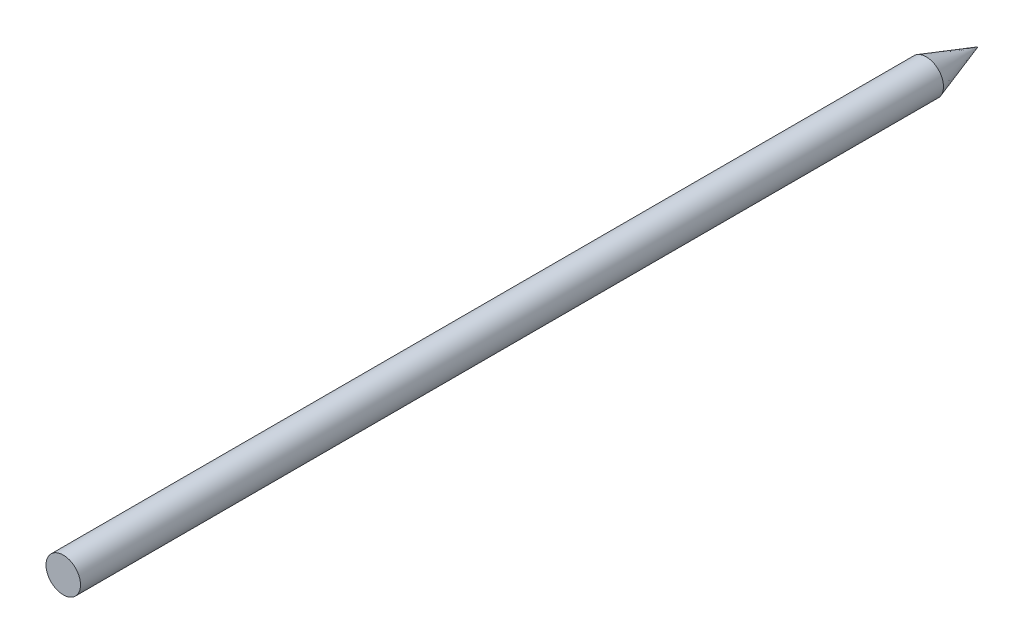
ISO-10303-21;
HEADER;
FILE_DESCRIPTION(('STEP AP214'),'2;1');
FILE_NAME('part.step','',(''),(''),'','','');
FILE_SCHEMA(('AUTOMOTIVE_DESIGN { 1 0 10303 214 1 1 1 1 }'));
ENDSEC;
DATA;
#1=APPLICATION_CONTEXT('core data for automotive mechanical design processes');
#2=APPLICATION_PROTOCOL_DEFINITION('international standard','automotive_design',2000,#1);
#3=PRODUCT_CONTEXT('',#1,'mechanical');
#4=PRODUCT('Part','Part','',(#3));
#5=PRODUCT_RELATED_PRODUCT_CATEGORY('part','',(#4));
#6=PRODUCT_DEFINITION_FORMATION('','',#4);
#7=PRODUCT_DEFINITION_CONTEXT('part definition',#1,'design');
#8=PRODUCT_DEFINITION('design','',#6,#7);
#9=PRODUCT_DEFINITION_SHAPE('','',#8);
#10=(LENGTH_UNIT() NAMED_UNIT(*) SI_UNIT(.MILLI.,.METRE.));
#11=(NAMED_UNIT(*) PLANE_ANGLE_UNIT() SI_UNIT($,.RADIAN.));
#12=(NAMED_UNIT(*) SI_UNIT($,.STERADIAN.) SOLID_ANGLE_UNIT());
#13=UNCERTAINTY_MEASURE_WITH_UNIT(LENGTH_MEASURE(1.E-05),#10,'distance_accuracy_value','');
#14=(GEOMETRIC_REPRESENTATION_CONTEXT(3) GLOBAL_UNCERTAINTY_ASSIGNED_CONTEXT((#13)) GLOBAL_UNIT_ASSIGNED_CONTEXT((#10,
#11,#12)) REPRESENTATION_CONTEXT('',''));
#15=CARTESIAN_POINT('',(0.,0.,0.));
#16=DIRECTION('',(0.,0.,1.));
#17=DIRECTION('',(1.,0.,0.));
#18=AXIS2_PLACEMENT_3D('',#15,#16,#17);
#19=CARTESIAN_POINT('',(0.,0.,-134.62));
#20=DIRECTION('',(0.,0.,1.));
#21=DIRECTION('',(1.,0.,0.));
#22=AXIS2_PLACEMENT_3D('',#19,#20,#21);
#23=CONICAL_SURFACE('',#22,0.,0.321750554396642);
#24=CARTESIAN_POINT('',(0.,0.,-127.));
#25=DIRECTION('',(0.,0.,-1.));
#26=DIRECTION('',(-1.,0.,0.));
#27=AXIS2_PLACEMENT_3D('',#24,#25,#26);
#28=CIRCLE('',#27,2.54000000000001);
#29=CARTESIAN_POINT('',(-2.54000000000001,0.,-127.));
#30=VERTEX_POINT('',#29);
#31=EDGE_CURVE('E48',#30,#30,#28,.T.);
#32=ORIENTED_EDGE('',*,*,#31,.T.);
#33=EDGE_LOOP('',(#32));
#34=FACE_BOUND('',#33,.T.);
#35=CARTESIAN_POINT('',(0.,0.,-134.62));
#36=VERTEX_POINT('',#35);
#37=VERTEX_LOOP('',#36);
#38=FACE_BOUND('',#37,.T.);
#39=ADVANCED_FACE('F41',(#34,#38),#23,.T.);
#40=CARTESIAN_POINT('',(0.,0.,0.));
#41=DIRECTION('',(0.,0.,1.));
#42=DIRECTION('',(1.,0.,0.));
#43=AXIS2_PLACEMENT_3D('',#40,#41,#42);
#44=PLANE('',#43);
#45=CARTESIAN_POINT('',(0.,0.,0.));
#46=DIRECTION('',(0.,0.,-1.));
#47=DIRECTION('',(-1.,0.,0.));
#48=AXIS2_PLACEMENT_3D('',#45,#46,#47);
#49=CIRCLE('',#48,2.54);
#50=CARTESIAN_POINT('',(-2.54,0.,0.));
#51=VERTEX_POINT('',#50);
#52=EDGE_CURVE('E11',#51,#51,#49,.T.);
#53=ORIENTED_EDGE('',*,*,#52,.F.);
#54=EDGE_LOOP('',(#53));
#55=FACE_BOUND('',#54,.T.);
#56=ADVANCED_FACE('F52',(#55),#44,.T.);
#57=CARTESIAN_POINT('',(0.,0.,-134.62));
#58=DIRECTION('',(0.,0.,-1.));
#59=DIRECTION('',(-1.,0.,0.));
#60=AXIS2_PLACEMENT_3D('',#57,#58,#59);
#61=CYLINDRICAL_SURFACE('',#60,2.54);
#62=ORIENTED_EDGE('',*,*,#52,.T.);
#63=EDGE_LOOP('',(#62));
#64=FACE_BOUND('',#63,.T.);
#65=ORIENTED_EDGE('',*,*,#31,.F.);
#66=EDGE_LOOP('',(#65));
#67=FACE_BOUND('',#66,.T.);
#68=ADVANCED_FACE('F57',(#64,#67),#61,.T.);
#69=CLOSED_SHELL('',(#39,#56,#68));
#70=MANIFOLD_SOLID_BREP('B2',#69);
#71=ADVANCED_BREP_SHAPE_REPRESENTATION('',(#18,#70),#14);
#72=SHAPE_DEFINITION_REPRESENTATION(#9,#71);
ENDSEC;
END-ISO-10303-21;
